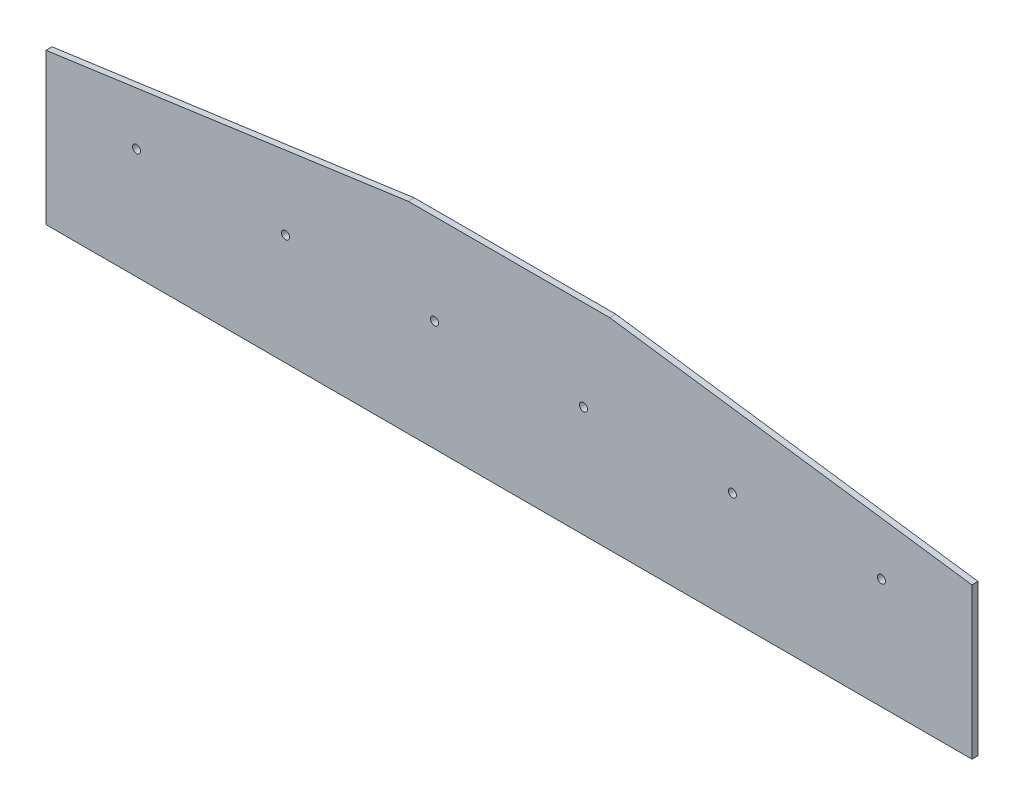
ISO-10303-21;
HEADER;
FILE_DESCRIPTION(('STEP AP214'),'2;1');
FILE_NAME('part.step','',(''),(''),'','','');
FILE_SCHEMA(('AUTOMOTIVE_DESIGN { 1 0 10303 214 1 1 1 1 }'));
ENDSEC;
DATA;
#1=APPLICATION_CONTEXT('core data for automotive mechanical design processes');
#2=APPLICATION_PROTOCOL_DEFINITION('international standard','automotive_design',2000,#1);
#3=PRODUCT_CONTEXT('',#1,'mechanical');
#4=PRODUCT('Part','Part','',(#3));
#5=PRODUCT_RELATED_PRODUCT_CATEGORY('part','',(#4));
#6=PRODUCT_DEFINITION_FORMATION('','',#4);
#7=PRODUCT_DEFINITION_CONTEXT('part definition',#1,'design');
#8=PRODUCT_DEFINITION('design','',#6,#7);
#9=PRODUCT_DEFINITION_SHAPE('','',#8);
#10=(LENGTH_UNIT() NAMED_UNIT(*) SI_UNIT(.MILLI.,.METRE.));
#11=(NAMED_UNIT(*) PLANE_ANGLE_UNIT() SI_UNIT($,.RADIAN.));
#12=(NAMED_UNIT(*) SI_UNIT($,.STERADIAN.) SOLID_ANGLE_UNIT());
#13=UNCERTAINTY_MEASURE_WITH_UNIT(LENGTH_MEASURE(1.E-05),#10,'distance_accuracy_value','');
#14=(GEOMETRIC_REPRESENTATION_CONTEXT(3) GLOBAL_UNCERTAINTY_ASSIGNED_CONTEXT((#13)) GLOBAL_UNIT_ASSIGNED_CONTEXT((#10,
#11,#12)) REPRESENTATION_CONTEXT('',''));
#15=CARTESIAN_POINT('',(0.,0.,0.));
#16=DIRECTION('',(0.,0.,1.));
#17=DIRECTION('',(1.,0.,0.));
#18=AXIS2_PLACEMENT_3D('',#15,#16,#17);
#19=CARTESIAN_POINT('',(0.,0.,3.));
#20=DIRECTION('',(0.,0.,-1.));
#21=DIRECTION('',(-1.,0.,0.));
#22=AXIS2_PLACEMENT_3D('',#19,#20,#21);
#23=PLANE('',#22);
#24=DIRECTION('',(0.,-1.,0.));
#25=VECTOR('',#24,1.);
#26=CARTESIAN_POINT('',(0.,0.,3.));
#27=LINE('',#26,#25);
#28=CARTESIAN_POINT('',(0.,75.,3.));
#29=VERTEX_POINT('',#28);
#30=CARTESIAN_POINT('',(0.,0.,3.));
#31=VERTEX_POINT('',#30);
#32=EDGE_CURVE('E131',#29,#31,#27,.T.);
#33=ORIENTED_EDGE('',*,*,#32,.T.);
#34=DIRECTION('',(1.,0.,0.));
#35=VECTOR('',#34,1.);
#36=CARTESIAN_POINT('',(0.,0.,3.));
#37=LINE('',#36,#35);
#38=CARTESIAN_POINT('',(460.,0.,3.));
#39=VERTEX_POINT('',#38);
#40=EDGE_CURVE('E89',#31,#39,#37,.T.);
#41=ORIENTED_EDGE('',*,*,#40,.T.);
#42=DIRECTION('',(0.,1.,0.));
#43=VECTOR('',#42,1.);
#44=CARTESIAN_POINT('',(460.,0.,3.));
#45=LINE('',#44,#43);
#46=CARTESIAN_POINT('',(460.,75.,3.));
#47=VERTEX_POINT('',#46);
#48=EDGE_CURVE('E102',#39,#47,#45,.T.);
#49=ORIENTED_EDGE('',*,*,#48,.T.);
#50=DIRECTION('',(-0.990492273177751,0.137568371274688,0.));
#51=VECTOR('',#50,1.);
#52=CARTESIAN_POINT('',(280.,100.,3.));
#53=LINE('',#52,#51);
#54=CARTESIAN_POINT('',(280.,100.,3.));
#55=VERTEX_POINT('',#54);
#56=EDGE_CURVE('E96',#47,#55,#53,.T.);
#57=ORIENTED_EDGE('',*,*,#56,.T.);
#58=DIRECTION('',(-1.,0.,0.));
#59=VECTOR('',#58,1.);
#60=CARTESIAN_POINT('',(180.,100.,3.));
#61=LINE('',#60,#59);
#62=CARTESIAN_POINT('',(180.,100.,3.));
#63=VERTEX_POINT('',#62);
#64=EDGE_CURVE('E100',#55,#63,#61,.T.);
#65=ORIENTED_EDGE('',*,*,#64,.T.);
#66=DIRECTION('',(-0.990492273177751,-0.137568371274688,0.));
#67=VECTOR('',#66,1.);
#68=CARTESIAN_POINT('',(0.,75.,3.));
#69=LINE('',#68,#67);
#70=EDGE_CURVE('E52',#63,#29,#69,.T.);
#71=ORIENTED_EDGE('',*,*,#70,.T.);
#72=EDGE_LOOP('',(#33,#41,#49,#57,#65,#71));
#73=FACE_BOUND('',#72,.T.);
#74=CARTESIAN_POINT('',(45.,55.,3.));
#75=DIRECTION('',(0.,0.,1.));
#76=DIRECTION('',(1.,0.,0.));
#77=AXIS2_PLACEMENT_3D('',#74,#75,#76);
#78=CIRCLE('',#77,2.);
#79=CARTESIAN_POINT('',(47.,55.,3.));
#80=VERTEX_POINT('',#79);
#81=EDGE_CURVE('E124',#80,#80,#78,.T.);
#82=ORIENTED_EDGE('',*,*,#81,.F.);
#83=EDGE_LOOP('',(#82));
#84=FACE_BOUND('',#83,.T.);
#85=CARTESIAN_POINT('',(119.,55.,3.));
#86=DIRECTION('',(0.,0.,1.));
#87=DIRECTION('',(1.,0.,0.));
#88=AXIS2_PLACEMENT_3D('',#85,#86,#87);
#89=CIRCLE('',#88,2.);
#90=CARTESIAN_POINT('',(121.,55.,3.));
#91=VERTEX_POINT('',#90);
#92=EDGE_CURVE('E215',#91,#91,#89,.T.);
#93=ORIENTED_EDGE('',*,*,#92,.F.);
#94=EDGE_LOOP('',(#93));
#95=FACE_BOUND('',#94,.T.);
#96=CARTESIAN_POINT('',(193.,55.,3.));
#97=DIRECTION('',(0.,0.,1.));
#98=DIRECTION('',(1.,0.,0.));
#99=AXIS2_PLACEMENT_3D('',#96,#97,#98);
#100=CIRCLE('',#99,2.00000000000003);
#101=CARTESIAN_POINT('',(195.,55.,3.));
#102=VERTEX_POINT('',#101);
#103=EDGE_CURVE('E209',#102,#102,#100,.T.);
#104=ORIENTED_EDGE('',*,*,#103,.F.);
#105=EDGE_LOOP('',(#104));
#106=FACE_BOUND('',#105,.T.);
#107=CARTESIAN_POINT('',(267.,55.,3.));
#108=DIRECTION('',(0.,0.,1.));
#109=DIRECTION('',(1.,0.,0.));
#110=AXIS2_PLACEMENT_3D('',#107,#108,#109);
#111=CIRCLE('',#110,2.);
#112=CARTESIAN_POINT('',(269.,55.,3.));
#113=VERTEX_POINT('',#112);
#114=EDGE_CURVE('E203',#113,#113,#111,.T.);
#115=ORIENTED_EDGE('',*,*,#114,.F.);
#116=EDGE_LOOP('',(#115));
#117=FACE_BOUND('',#116,.T.);
#118=CARTESIAN_POINT('',(341.,55.,3.));
#119=DIRECTION('',(0.,0.,1.));
#120=DIRECTION('',(1.,0.,0.));
#121=AXIS2_PLACEMENT_3D('',#118,#119,#120);
#122=CIRCLE('',#121,2.);
#123=CARTESIAN_POINT('',(343.,55.,3.));
#124=VERTEX_POINT('',#123);
#125=EDGE_CURVE('E197',#124,#124,#122,.T.);
#126=ORIENTED_EDGE('',*,*,#125,.F.);
#127=EDGE_LOOP('',(#126));
#128=FACE_BOUND('',#127,.T.);
#129=CARTESIAN_POINT('',(415.,55.,3.));
#130=DIRECTION('',(0.,0.,1.));
#131=DIRECTION('',(1.,0.,0.));
#132=AXIS2_PLACEMENT_3D('',#129,#130,#131);
#133=CIRCLE('',#132,2.);
#134=CARTESIAN_POINT('',(417.,55.,3.));
#135=VERTEX_POINT('',#134);
#136=EDGE_CURVE('E188',#135,#135,#133,.T.);
#137=ORIENTED_EDGE('',*,*,#136,.F.);
#138=EDGE_LOOP('',(#137));
#139=FACE_BOUND('',#138,.T.);
#140=ADVANCED_FACE('F35',(#73,#84,#95,#106,#117,#128,#139),#23,.F.);
#141=CARTESIAN_POINT('',(0.,0.,0.));
#142=DIRECTION('',(0.,0.,-1.));
#143=DIRECTION('',(-1.,0.,0.));
#144=AXIS2_PLACEMENT_3D('',#141,#142,#143);
#145=PLANE('',#144);
#146=CARTESIAN_POINT('',(341.,55.,0.));
#147=DIRECTION('',(0.,0.,1.));
#148=DIRECTION('',(1.,0.,0.));
#149=AXIS2_PLACEMENT_3D('',#146,#147,#148);
#150=CIRCLE('',#149,2.);
#151=CARTESIAN_POINT('',(343.,55.,0.));
#152=VERTEX_POINT('',#151);
#153=EDGE_CURVE('E194',#152,#152,#150,.T.);
#154=ORIENTED_EDGE('',*,*,#153,.T.);
#155=EDGE_LOOP('',(#154));
#156=FACE_BOUND('',#155,.T.);
#157=CARTESIAN_POINT('',(193.,55.,0.));
#158=DIRECTION('',(0.,0.,1.));
#159=DIRECTION('',(1.,0.,0.));
#160=AXIS2_PLACEMENT_3D('',#157,#158,#159);
#161=CIRCLE('',#160,2.00000000000003);
#162=CARTESIAN_POINT('',(195.,55.,0.));
#163=VERTEX_POINT('',#162);
#164=EDGE_CURVE('E206',#163,#163,#161,.T.);
#165=ORIENTED_EDGE('',*,*,#164,.T.);
#166=EDGE_LOOP('',(#165));
#167=FACE_BOUND('',#166,.T.);
#168=CARTESIAN_POINT('',(45.,55.,0.));
#169=DIRECTION('',(0.,0.,1.));
#170=DIRECTION('',(1.,0.,0.));
#171=AXIS2_PLACEMENT_3D('',#168,#169,#170);
#172=CIRCLE('',#171,2.);
#173=CARTESIAN_POINT('',(47.,55.,0.));
#174=VERTEX_POINT('',#173);
#175=EDGE_CURVE('E218',#174,#174,#172,.T.);
#176=ORIENTED_EDGE('',*,*,#175,.T.);
#177=EDGE_LOOP('',(#176));
#178=FACE_BOUND('',#177,.T.);
#179=DIRECTION('',(0.,-1.,0.));
#180=VECTOR('',#179,1.);
#181=CARTESIAN_POINT('',(0.,0.,0.));
#182=LINE('',#181,#180);
#183=CARTESIAN_POINT('',(0.,75.,0.));
#184=VERTEX_POINT('',#183);
#185=CARTESIAN_POINT('',(0.,0.,0.));
#186=VERTEX_POINT('',#185);
#187=EDGE_CURVE('E120',#184,#186,#182,.T.);
#188=ORIENTED_EDGE('',*,*,#187,.F.);
#189=DIRECTION('',(-0.990492273177751,-0.137568371274688,0.));
#190=VECTOR('',#189,1.);
#191=CARTESIAN_POINT('',(0.,75.,0.));
#192=LINE('',#191,#190);
#193=CARTESIAN_POINT('',(180.,100.,0.));
#194=VERTEX_POINT('',#193);
#195=EDGE_CURVE('E81',#194,#184,#192,.T.);
#196=ORIENTED_EDGE('',*,*,#195,.F.);
#197=DIRECTION('',(-1.,0.,0.));
#198=VECTOR('',#197,1.);
#199=CARTESIAN_POINT('',(180.,100.,0.));
#200=LINE('',#199,#198);
#201=CARTESIAN_POINT('',(280.,100.,0.));
#202=VERTEX_POINT('',#201);
#203=EDGE_CURVE('E75',#202,#194,#200,.T.);
#204=ORIENTED_EDGE('',*,*,#203,.F.);
#205=DIRECTION('',(-0.990492273177751,0.137568371274688,0.));
#206=VECTOR('',#205,1.);
#207=CARTESIAN_POINT('',(280.,100.,0.));
#208=LINE('',#207,#206);
#209=CARTESIAN_POINT('',(460.,75.,0.));
#210=VERTEX_POINT('',#209);
#211=EDGE_CURVE('E110',#210,#202,#208,.T.);
#212=ORIENTED_EDGE('',*,*,#211,.F.);
#213=DIRECTION('',(0.,1.,0.));
#214=VECTOR('',#213,1.);
#215=CARTESIAN_POINT('',(460.,0.,0.));
#216=LINE('',#215,#214);
#217=CARTESIAN_POINT('',(460.,0.,0.));
#218=VERTEX_POINT('',#217);
#219=EDGE_CURVE('E126',#218,#210,#216,.T.);
#220=ORIENTED_EDGE('',*,*,#219,.F.);
#221=DIRECTION('',(1.,0.,0.));
#222=VECTOR('',#221,1.);
#223=CARTESIAN_POINT('',(0.,0.,0.));
#224=LINE('',#223,#222);
#225=EDGE_CURVE('E123',#186,#218,#224,.T.);
#226=ORIENTED_EDGE('',*,*,#225,.F.);
#227=EDGE_LOOP('',(#188,#196,#204,#212,#220,#226));
#228=FACE_BOUND('',#227,.T.);
#229=CARTESIAN_POINT('',(119.,55.,0.));
#230=DIRECTION('',(0.,0.,1.));
#231=DIRECTION('',(1.,0.,0.));
#232=AXIS2_PLACEMENT_3D('',#229,#230,#231);
#233=CIRCLE('',#232,2.);
#234=CARTESIAN_POINT('',(121.,55.,0.));
#235=VERTEX_POINT('',#234);
#236=EDGE_CURVE('E212',#235,#235,#233,.T.);
#237=ORIENTED_EDGE('',*,*,#236,.T.);
#238=EDGE_LOOP('',(#237));
#239=FACE_BOUND('',#238,.T.);
#240=CARTESIAN_POINT('',(267.,55.,0.));
#241=DIRECTION('',(0.,0.,1.));
#242=DIRECTION('',(1.,0.,0.));
#243=AXIS2_PLACEMENT_3D('',#240,#241,#242);
#244=CIRCLE('',#243,2.);
#245=CARTESIAN_POINT('',(269.,55.,0.));
#246=VERTEX_POINT('',#245);
#247=EDGE_CURVE('E200',#246,#246,#244,.T.);
#248=ORIENTED_EDGE('',*,*,#247,.T.);
#249=EDGE_LOOP('',(#248));
#250=FACE_BOUND('',#249,.T.);
#251=CARTESIAN_POINT('',(415.,55.,0.));
#252=DIRECTION('',(0.,0.,1.));
#253=DIRECTION('',(1.,0.,0.));
#254=AXIS2_PLACEMENT_3D('',#251,#252,#253);
#255=CIRCLE('',#254,2.);
#256=CARTESIAN_POINT('',(417.,55.,0.));
#257=VERTEX_POINT('',#256);
#258=EDGE_CURVE('E191',#257,#257,#255,.T.);
#259=ORIENTED_EDGE('',*,*,#258,.T.);
#260=EDGE_LOOP('',(#259));
#261=FACE_BOUND('',#260,.T.);
#262=ADVANCED_FACE('F140',(#156,#167,#178,#228,#239,#250,#261),#145,.T.);
#263=CARTESIAN_POINT('',(0.,0.,3.));
#264=DIRECTION('',(1.,0.,0.));
#265=DIRECTION('',(0.,0.,-1.));
#266=AXIS2_PLACEMENT_3D('',#263,#264,#265);
#267=PLANE('',#266);
#268=ORIENTED_EDGE('',*,*,#187,.T.);
#269=DIRECTION('',(0.,0.,-1.));
#270=VECTOR('',#269,1.);
#271=CARTESIAN_POINT('',(0.,0.,3.));
#272=LINE('',#271,#270);
#273=EDGE_CURVE('E11',#31,#186,#272,.T.);
#274=ORIENTED_EDGE('',*,*,#273,.F.);
#275=ORIENTED_EDGE('',*,*,#32,.F.);
#276=DIRECTION('',(0.,0.,-1.));
#277=VECTOR('',#276,1.);
#278=CARTESIAN_POINT('',(0.,75.,3.));
#279=LINE('',#278,#277);
#280=EDGE_CURVE('E116',#29,#184,#279,.T.);
#281=ORIENTED_EDGE('',*,*,#280,.T.);
#282=EDGE_LOOP('',(#268,#274,#275,#281));
#283=FACE_BOUND('',#282,.T.);
#284=ADVANCED_FACE('F37',(#283),#267,.F.);
#285=CARTESIAN_POINT('',(0.,0.,3.));
#286=DIRECTION('',(0.,1.,0.));
#287=DIRECTION('',(0.,0.,1.));
#288=AXIS2_PLACEMENT_3D('',#285,#286,#287);
#289=PLANE('',#288);
#290=ORIENTED_EDGE('',*,*,#225,.T.);
#291=DIRECTION('',(0.,0.,-1.));
#292=VECTOR('',#291,1.);
#293=CARTESIAN_POINT('',(460.,0.,3.));
#294=LINE('',#293,#292);
#295=EDGE_CURVE('E44',#39,#218,#294,.T.);
#296=ORIENTED_EDGE('',*,*,#295,.F.);
#297=ORIENTED_EDGE('',*,*,#40,.F.);
#298=ORIENTED_EDGE('',*,*,#273,.T.);
#299=EDGE_LOOP('',(#290,#296,#297,#298));
#300=FACE_BOUND('',#299,.T.);
#301=ADVANCED_FACE('F296',(#300),#289,.F.);
#302=CARTESIAN_POINT('',(460.,0.,3.));
#303=DIRECTION('',(-1.,0.,0.));
#304=DIRECTION('',(0.,0.,1.));
#305=AXIS2_PLACEMENT_3D('',#302,#303,#304);
#306=PLANE('',#305);
#307=ORIENTED_EDGE('',*,*,#219,.T.);
#308=DIRECTION('',(0.,0.,-1.));
#309=VECTOR('',#308,1.);
#310=CARTESIAN_POINT('',(460.,75.,3.));
#311=LINE('',#310,#309);
#312=EDGE_CURVE('E111',#47,#210,#311,.T.);
#313=ORIENTED_EDGE('',*,*,#312,.F.);
#314=ORIENTED_EDGE('',*,*,#48,.F.);
#315=ORIENTED_EDGE('',*,*,#295,.T.);
#316=EDGE_LOOP('',(#307,#313,#314,#315));
#317=FACE_BOUND('',#316,.T.);
#318=ADVANCED_FACE('F137',(#317),#306,.F.);
#319=CARTESIAN_POINT('',(280.,100.,3.));
#320=DIRECTION('',(-0.137568371274688,-0.990492273177752,0.));
#321=DIRECTION('',(0.990492273177752,-0.137568371274688,0.));
#322=AXIS2_PLACEMENT_3D('',#319,#320,#321);
#323=PLANE('',#322);
#324=ORIENTED_EDGE('',*,*,#211,.T.);
#325=DIRECTION('',(0.,0.,-1.));
#326=VECTOR('',#325,1.);
#327=CARTESIAN_POINT('',(280.,100.,3.));
#328=LINE('',#327,#326);
#329=EDGE_CURVE('E107',#55,#202,#328,.T.);
#330=ORIENTED_EDGE('',*,*,#329,.F.);
#331=ORIENTED_EDGE('',*,*,#56,.F.);
#332=ORIENTED_EDGE('',*,*,#312,.T.);
#333=EDGE_LOOP('',(#324,#330,#331,#332));
#334=FACE_BOUND('',#333,.T.);
#335=ADVANCED_FACE('F108',(#334),#323,.F.);
#336=CARTESIAN_POINT('',(180.,100.,3.));
#337=DIRECTION('',(0.,-1.,0.));
#338=DIRECTION('',(0.,0.,-1.));
#339=AXIS2_PLACEMENT_3D('',#336,#337,#338);
#340=PLANE('',#339);
#341=ORIENTED_EDGE('',*,*,#203,.T.);
#342=DIRECTION('',(0.,0.,-1.));
#343=VECTOR('',#342,1.);
#344=CARTESIAN_POINT('',(180.,100.,3.));
#345=LINE('',#344,#343);
#346=EDGE_CURVE('E112',#63,#194,#345,.T.);
#347=ORIENTED_EDGE('',*,*,#346,.F.);
#348=ORIENTED_EDGE('',*,*,#64,.F.);
#349=ORIENTED_EDGE('',*,*,#329,.T.);
#350=EDGE_LOOP('',(#341,#347,#348,#349));
#351=FACE_BOUND('',#350,.T.);
#352=ADVANCED_FACE('F114',(#351),#340,.F.);
#353=CARTESIAN_POINT('',(0.,75.,3.));
#354=DIRECTION('',(0.137568371274688,-0.990492273177752,0.));
#355=DIRECTION('',(0.990492273177752,0.137568371274688,0.));
#356=AXIS2_PLACEMENT_3D('',#353,#354,#355);
#357=PLANE('',#356);
#358=ORIENTED_EDGE('',*,*,#195,.T.);
#359=ORIENTED_EDGE('',*,*,#280,.F.);
#360=ORIENTED_EDGE('',*,*,#70,.F.);
#361=ORIENTED_EDGE('',*,*,#346,.T.);
#362=EDGE_LOOP('',(#358,#359,#360,#361));
#363=FACE_BOUND('',#362,.T.);
#364=ADVANCED_FACE('F145',(#363),#357,.F.);
#365=CARTESIAN_POINT('',(45.,55.,3.));
#366=DIRECTION('',(0.,0.,-1.));
#367=DIRECTION('',(-1.,0.,0.));
#368=AXIS2_PLACEMENT_3D('',#365,#366,#367);
#369=CYLINDRICAL_SURFACE('',#368,2.);
#370=ORIENTED_EDGE('',*,*,#81,.T.);
#371=EDGE_LOOP('',(#370));
#372=FACE_BOUND('',#371,.T.);
#373=ORIENTED_EDGE('',*,*,#175,.F.);
#374=EDGE_LOOP('',(#373));
#375=FACE_BOUND('',#374,.T.);
#376=ADVANCED_FACE('F147',(#372,#375),#369,.F.);
#377=CARTESIAN_POINT('',(119.,55.,3.));
#378=DIRECTION('',(0.,0.,-1.));
#379=DIRECTION('',(-1.,0.,0.));
#380=AXIS2_PLACEMENT_3D('',#377,#378,#379);
#381=CYLINDRICAL_SURFACE('',#380,2.);
#382=ORIENTED_EDGE('',*,*,#92,.T.);
#383=EDGE_LOOP('',(#382));
#384=FACE_BOUND('',#383,.T.);
#385=ORIENTED_EDGE('',*,*,#236,.F.);
#386=EDGE_LOOP('',(#385));
#387=FACE_BOUND('',#386,.T.);
#388=ADVANCED_FACE('F153',(#384,#387),#381,.F.);
#389=CARTESIAN_POINT('',(193.,55.,3.));
#390=DIRECTION('',(0.,0.,-1.));
#391=DIRECTION('',(-1.,0.,0.));
#392=AXIS2_PLACEMENT_3D('',#389,#390,#391);
#393=CYLINDRICAL_SURFACE('',#392,2.00000000000003);
#394=ORIENTED_EDGE('',*,*,#103,.T.);
#395=EDGE_LOOP('',(#394));
#396=FACE_BOUND('',#395,.T.);
#397=ORIENTED_EDGE('',*,*,#164,.F.);
#398=EDGE_LOOP('',(#397));
#399=FACE_BOUND('',#398,.T.);
#400=ADVANCED_FACE('F167',(#396,#399),#393,.F.);
#401=CARTESIAN_POINT('',(267.,55.,3.));
#402=DIRECTION('',(0.,0.,-1.));
#403=DIRECTION('',(-1.,0.,0.));
#404=AXIS2_PLACEMENT_3D('',#401,#402,#403);
#405=CYLINDRICAL_SURFACE('',#404,2.);
#406=ORIENTED_EDGE('',*,*,#114,.T.);
#407=EDGE_LOOP('',(#406));
#408=FACE_BOUND('',#407,.T.);
#409=ORIENTED_EDGE('',*,*,#247,.F.);
#410=EDGE_LOOP('',(#409));
#411=FACE_BOUND('',#410,.T.);
#412=ADVANCED_FACE('F171',(#408,#411),#405,.F.);
#413=CARTESIAN_POINT('',(341.,55.,3.));
#414=DIRECTION('',(0.,0.,-1.));
#415=DIRECTION('',(-1.,0.,0.));
#416=AXIS2_PLACEMENT_3D('',#413,#414,#415);
#417=CYLINDRICAL_SURFACE('',#416,2.);
#418=ORIENTED_EDGE('',*,*,#125,.T.);
#419=EDGE_LOOP('',(#418));
#420=FACE_BOUND('',#419,.T.);
#421=ORIENTED_EDGE('',*,*,#153,.F.);
#422=EDGE_LOOP('',(#421));
#423=FACE_BOUND('',#422,.T.);
#424=ADVANCED_FACE('F175',(#420,#423),#417,.F.);
#425=CARTESIAN_POINT('',(415.,55.,3.));
#426=DIRECTION('',(0.,0.,-1.));
#427=DIRECTION('',(-1.,0.,0.));
#428=AXIS2_PLACEMENT_3D('',#425,#426,#427);
#429=CYLINDRICAL_SURFACE('',#428,2.);
#430=ORIENTED_EDGE('',*,*,#136,.T.);
#431=EDGE_LOOP('',(#430));
#432=FACE_BOUND('',#431,.T.);
#433=ORIENTED_EDGE('',*,*,#258,.F.);
#434=EDGE_LOOP('',(#433));
#435=FACE_BOUND('',#434,.T.);
#436=ADVANCED_FACE('F179',(#432,#435),#429,.F.);
#437=CLOSED_SHELL('',(#140,#262,#284,#301,#318,#335,#352,#364,#376,#388,#400,#412,#424,#436));
#438=MANIFOLD_SOLID_BREP('B2',#437);
#439=ADVANCED_BREP_SHAPE_REPRESENTATION('',(#18,#438),#14);
#440=SHAPE_DEFINITION_REPRESENTATION(#9,#439);
ENDSEC;
END-ISO-10303-21;
